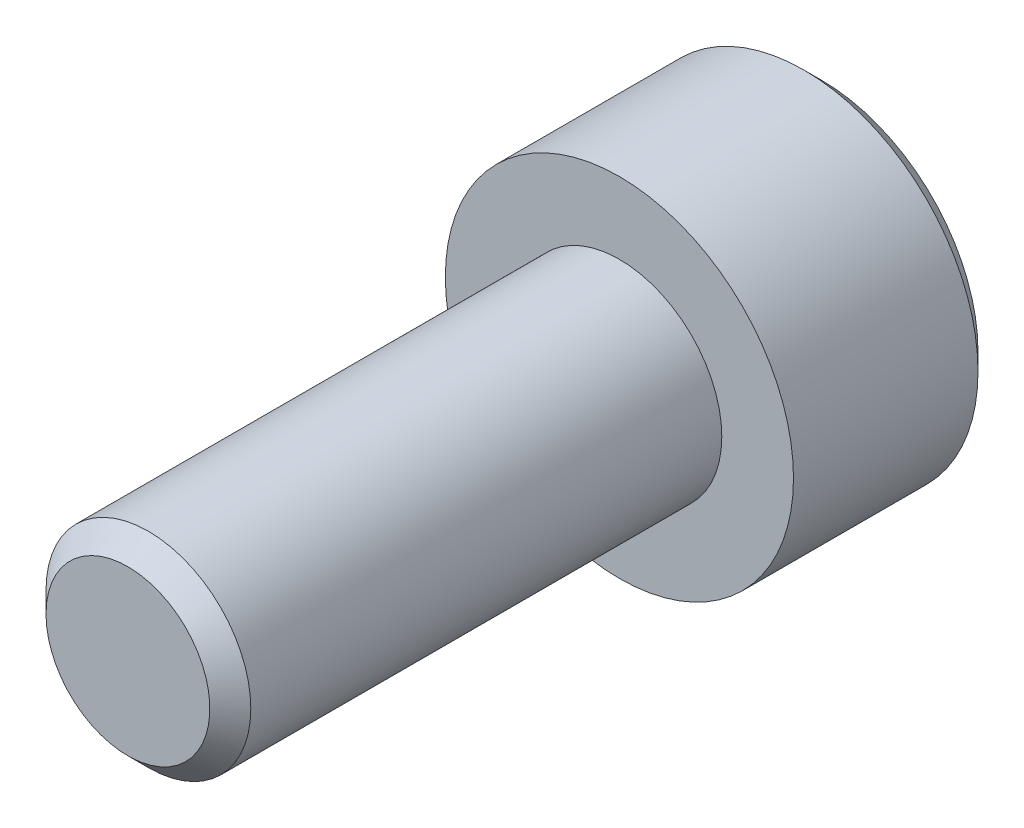
ISO-10303-21;
HEADER;
FILE_DESCRIPTION(('STEP AP214'),'2;1');
FILE_NAME('part.step','',(''),(''),'','','');
FILE_SCHEMA(('AUTOMOTIVE_DESIGN { 1 0 10303 214 1 1 1 1 }'));
ENDSEC;
DATA;
#1=APPLICATION_CONTEXT('core data for automotive mechanical design processes');
#2=APPLICATION_PROTOCOL_DEFINITION('international standard','automotive_design',2000,#1);
#3=PRODUCT_CONTEXT('',#1,'mechanical');
#4=PRODUCT('Part','Part','',(#3));
#5=PRODUCT_RELATED_PRODUCT_CATEGORY('part','',(#4));
#6=PRODUCT_DEFINITION_FORMATION('','',#4);
#7=PRODUCT_DEFINITION_CONTEXT('part definition',#1,'design');
#8=PRODUCT_DEFINITION('design','',#6,#7);
#9=PRODUCT_DEFINITION_SHAPE('','',#8);
#10=(LENGTH_UNIT() NAMED_UNIT(*) SI_UNIT(.MILLI.,.METRE.));
#11=(NAMED_UNIT(*) PLANE_ANGLE_UNIT() SI_UNIT($,.RADIAN.));
#12=(NAMED_UNIT(*) SI_UNIT($,.STERADIAN.) SOLID_ANGLE_UNIT());
#13=UNCERTAINTY_MEASURE_WITH_UNIT(LENGTH_MEASURE(1.E-05),#10,'distance_accuracy_value','');
#14=(GEOMETRIC_REPRESENTATION_CONTEXT(3) GLOBAL_UNCERTAINTY_ASSIGNED_CONTEXT((#13)) GLOBAL_UNIT_ASSIGNED_CONTEXT((#10,
#11,#12)) REPRESENTATION_CONTEXT('',''));
#15=CARTESIAN_POINT('',(0.,0.,0.));
#16=DIRECTION('',(0.,0.,1.));
#17=DIRECTION('',(1.,0.,0.));
#18=AXIS2_PLACEMENT_3D('',#15,#16,#17);
#19=CARTESIAN_POINT('',(0.,0.,-2.43));
#20=DIRECTION('',(0.,0.,1.));
#21=DIRECTION('',(1.,0.,0.));
#22=AXIS2_PLACEMENT_3D('',#19,#20,#21);
#23=PLANE('',#22);
#24=DIRECTION('',(-0.866025403784439,0.5,0.));
#25=VECTOR('',#24,1.);
#26=CARTESIAN_POINT('',(0.,2.3094010767585,-2.43));
#27=LINE('',#26,#25);
#28=CARTESIAN_POINT('',(0.,2.3094010767585,-2.43));
#29=VERTEX_POINT('',#28);
#30=CARTESIAN_POINT('',(2.,1.15470053837925,-2.43));
#31=VERTEX_POINT('',#30);
#32=EDGE_CURVE('E130',#29,#31,#27,.F.);
#33=ORIENTED_EDGE('',*,*,#32,.T.);
#34=DIRECTION('',(0.,1.,0.));
#35=VECTOR('',#34,1.);
#36=CARTESIAN_POINT('',(2.,1.15470053837925,-2.43));
#37=LINE('',#36,#35);
#38=CARTESIAN_POINT('',(2.,-1.15470053837925,-2.43));
#39=VERTEX_POINT('',#38);
#40=EDGE_CURVE('E125',#31,#39,#37,.F.);
#41=ORIENTED_EDGE('',*,*,#40,.T.);
#42=DIRECTION('',(0.866025403784439,0.499999999999999,0.));
#43=VECTOR('',#42,1.);
#44=CARTESIAN_POINT('',(2.,-1.15470053837925,-2.43));
#45=LINE('',#44,#43);
#46=CARTESIAN_POINT('',(0.,-2.3094010767585,-2.43));
#47=VERTEX_POINT('',#46);
#48=EDGE_CURVE('E74',#39,#47,#45,.F.);
#49=ORIENTED_EDGE('',*,*,#48,.T.);
#50=DIRECTION('',(0.866025403784438,-0.5,0.));
#51=VECTOR('',#50,1.);
#52=CARTESIAN_POINT('',(0.,-2.3094010767585,-2.43));
#53=LINE('',#52,#51);
#54=CARTESIAN_POINT('',(-2.,-1.15470053837925,-2.43));
#55=VERTEX_POINT('',#54);
#56=EDGE_CURVE('E71',#47,#55,#53,.F.);
#57=ORIENTED_EDGE('',*,*,#56,.T.);
#58=DIRECTION('',(0.,1.,0.));
#59=VECTOR('',#58,1.);
#60=CARTESIAN_POINT('',(-2.,-1.15470053837925,-2.43));
#61=LINE('',#60,#59);
#62=CARTESIAN_POINT('',(-2.,1.15470053837925,-2.43));
#63=VERTEX_POINT('',#62);
#64=EDGE_CURVE('E68',#55,#63,#61,.T.);
#65=ORIENTED_EDGE('',*,*,#64,.T.);
#66=DIRECTION('',(-0.866025403784439,-0.5,0.));
#67=VECTOR('',#66,1.);
#68=CARTESIAN_POINT('',(-2.,1.15470053837925,-2.43));
#69=LINE('',#68,#67);
#70=EDGE_CURVE('E91',#63,#29,#69,.F.);
#71=ORIENTED_EDGE('',*,*,#70,.T.);
#72=EDGE_LOOP('',(#33,#41,#49,#57,#65,#71));
#73=FACE_BOUND('',#72,.T.);
#74=ADVANCED_FACE('F17',(#73),#23,.F.);
#75=CARTESIAN_POINT('',(0.,-2.3094010767585,-4.93));
#76=DIRECTION('',(-0.5,-0.866025403784438,0.));
#77=DIRECTION('',(0.866025403784438,-0.5,0.));
#78=AXIS2_PLACEMENT_3D('',#75,#76,#77);
#79=PLANE('',#78);
#80=ORIENTED_EDGE('',*,*,#56,.F.);
#81=DIRECTION('',(0.,0.,1.));
#82=VECTOR('',#81,1.);
#83=CARTESIAN_POINT('',(0.,-2.3094010767585,-4.93));
#84=LINE('',#83,#82);
#85=CARTESIAN_POINT('',(0.,-2.3094010767585,-4.93));
#86=VERTEX_POINT('',#85);
#87=EDGE_CURVE('E120',#47,#86,#84,.F.);
#88=ORIENTED_EDGE('',*,*,#87,.T.);
#89=DIRECTION('',(-0.866025403784439,0.5,0.));
#90=VECTOR('',#89,1.);
#91=CARTESIAN_POINT('',(0.,-2.3094010767585,-4.93));
#92=LINE('',#91,#90);
#93=CARTESIAN_POINT('',(-2.,-1.15470053837925,-4.93));
#94=VERTEX_POINT('',#93);
#95=EDGE_CURVE('E82',#86,#94,#92,.T.);
#96=ORIENTED_EDGE('',*,*,#95,.T.);
#97=DIRECTION('',(0.,0.,1.));
#98=VECTOR('',#97,1.);
#99=CARTESIAN_POINT('',(-2.,-1.15470053837925,-4.93));
#100=LINE('',#99,#98);
#101=EDGE_CURVE('E77',#94,#55,#100,.T.);
#102=ORIENTED_EDGE('',*,*,#101,.T.);
#103=EDGE_LOOP('',(#80,#88,#96,#102));
#104=FACE_BOUND('',#103,.T.);
#105=ADVANCED_FACE('F80',(#104),#79,.F.);
#106=CARTESIAN_POINT('',(-2.,-1.15470053837925,-4.93));
#107=DIRECTION('',(-1.,0.,0.));
#108=DIRECTION('',(0.,0.,1.));
#109=AXIS2_PLACEMENT_3D('',#106,#107,#108);
#110=PLANE('',#109);
#111=ORIENTED_EDGE('',*,*,#64,.F.);
#112=ORIENTED_EDGE('',*,*,#101,.F.);
#113=DIRECTION('',(0.,1.,0.));
#114=VECTOR('',#113,1.);
#115=CARTESIAN_POINT('',(-2.,0.,-4.93));
#116=LINE('',#115,#114);
#117=CARTESIAN_POINT('',(-2.,1.15470053837925,-4.93));
#118=VERTEX_POINT('',#117);
#119=EDGE_CURVE('E117',#94,#118,#116,.T.);
#120=ORIENTED_EDGE('',*,*,#119,.T.);
#121=DIRECTION('',(0.,0.,1.));
#122=VECTOR('',#121,1.);
#123=CARTESIAN_POINT('',(-2.,1.15470053837925,-4.93));
#124=LINE('',#123,#122);
#125=EDGE_CURVE('E88',#118,#63,#124,.T.);
#126=ORIENTED_EDGE('',*,*,#125,.T.);
#127=EDGE_LOOP('',(#111,#112,#120,#126));
#128=FACE_BOUND('',#127,.T.);
#129=ADVANCED_FACE('F86',(#128),#110,.F.);
#130=CARTESIAN_POINT('',(-2.,1.15470053837925,-4.93));
#131=DIRECTION('',(-0.5,0.866025403784439,0.));
#132=DIRECTION('',(-0.866025403784439,-0.5,0.));
#133=AXIS2_PLACEMENT_3D('',#130,#131,#132);
#134=PLANE('',#133);
#135=ORIENTED_EDGE('',*,*,#70,.F.);
#136=ORIENTED_EDGE('',*,*,#125,.F.);
#137=DIRECTION('',(0.866025403784439,0.499999999999999,0.));
#138=VECTOR('',#137,1.);
#139=CARTESIAN_POINT('',(-2.,1.15470053837925,-4.93));
#140=LINE('',#139,#138);
#141=CARTESIAN_POINT('',(0.,2.3094010767585,-4.93));
#142=VERTEX_POINT('',#141);
#143=EDGE_CURVE('E115',#118,#142,#140,.T.);
#144=ORIENTED_EDGE('',*,*,#143,.T.);
#145=DIRECTION('',(0.,0.,1.));
#146=VECTOR('',#145,1.);
#147=CARTESIAN_POINT('',(0.,2.3094010767585,-4.93));
#148=LINE('',#147,#146);
#149=EDGE_CURVE('E132',#142,#29,#148,.T.);
#150=ORIENTED_EDGE('',*,*,#149,.T.);
#151=EDGE_LOOP('',(#135,#136,#144,#150));
#152=FACE_BOUND('',#151,.T.);
#153=ADVANCED_FACE('F137',(#152),#134,.F.);
#154=CARTESIAN_POINT('',(0.,2.3094010767585,-4.93));
#155=DIRECTION('',(0.5,0.866025403784439,0.));
#156=DIRECTION('',(-0.866025403784439,0.5,0.));
#157=AXIS2_PLACEMENT_3D('',#154,#155,#156);
#158=PLANE('',#157);
#159=ORIENTED_EDGE('',*,*,#32,.F.);
#160=ORIENTED_EDGE('',*,*,#149,.F.);
#161=DIRECTION('',(0.866025403784439,-0.5,0.));
#162=VECTOR('',#161,1.);
#163=CARTESIAN_POINT('',(0.,2.3094010767585,-4.93));
#164=LINE('',#163,#162);
#165=CARTESIAN_POINT('',(2.,1.15470053837925,-4.93));
#166=VERTEX_POINT('',#165);
#167=EDGE_CURVE('E113',#142,#166,#164,.T.);
#168=ORIENTED_EDGE('',*,*,#167,.T.);
#169=DIRECTION('',(0.,0.,-1.));
#170=VECTOR('',#169,1.);
#171=CARTESIAN_POINT('',(2.,1.15470053837925,-4.93));
#172=LINE('',#171,#170);
#173=EDGE_CURVE('E127',#166,#31,#172,.F.);
#174=ORIENTED_EDGE('',*,*,#173,.T.);
#175=EDGE_LOOP('',(#159,#160,#168,#174));
#176=FACE_BOUND('',#175,.T.);
#177=ADVANCED_FACE('F141',(#176),#158,.F.);
#178=CARTESIAN_POINT('',(2.,1.15470053837925,-4.93));
#179=DIRECTION('',(1.,0.,0.));
#180=DIRECTION('',(0.,0.,-1.));
#181=AXIS2_PLACEMENT_3D('',#178,#179,#180);
#182=PLANE('',#181);
#183=ORIENTED_EDGE('',*,*,#40,.F.);
#184=ORIENTED_EDGE('',*,*,#173,.F.);
#185=DIRECTION('',(0.,1.,0.));
#186=VECTOR('',#185,1.);
#187=CARTESIAN_POINT('',(2.,0.,-4.93));
#188=LINE('',#187,#186);
#189=CARTESIAN_POINT('',(2.,-1.15470053837925,-4.93));
#190=VERTEX_POINT('',#189);
#191=EDGE_CURVE('E35',#166,#190,#188,.F.);
#192=ORIENTED_EDGE('',*,*,#191,.T.);
#193=DIRECTION('',(0.,0.,1.));
#194=VECTOR('',#193,1.);
#195=CARTESIAN_POINT('',(2.,-1.15470053837925,-4.93));
#196=LINE('',#195,#194);
#197=EDGE_CURVE('E123',#190,#39,#196,.T.);
#198=ORIENTED_EDGE('',*,*,#197,.T.);
#199=EDGE_LOOP('',(#183,#184,#192,#198));
#200=FACE_BOUND('',#199,.T.);
#201=ADVANCED_FACE('F143',(#200),#182,.F.);
#202=CARTESIAN_POINT('',(2.,-1.15470053837925,-4.93));
#203=DIRECTION('',(0.499999999999999,-0.866025403784439,0.));
#204=DIRECTION('',(0.866025403784439,0.499999999999999,0.));
#205=AXIS2_PLACEMENT_3D('',#202,#203,#204);
#206=PLANE('',#205);
#207=ORIENTED_EDGE('',*,*,#48,.F.);
#208=ORIENTED_EDGE('',*,*,#197,.F.);
#209=DIRECTION('',(-0.866025403784439,-0.499999999999999,0.));
#210=VECTOR('',#209,1.);
#211=CARTESIAN_POINT('',(2.,-1.15470053837925,-4.93));
#212=LINE('',#211,#210);
#213=EDGE_CURVE('E107',#190,#86,#212,.T.);
#214=ORIENTED_EDGE('',*,*,#213,.T.);
#215=ORIENTED_EDGE('',*,*,#87,.F.);
#216=EDGE_LOOP('',(#207,#208,#214,#215));
#217=FACE_BOUND('',#216,.T.);
#218=ADVANCED_FACE('F146',(#217),#206,.F.);
#219=CARTESIAN_POINT('',(0.,0.,-4.93));
#220=DIRECTION('',(0.,0.,1.));
#221=DIRECTION('',(1.,0.,0.));
#222=AXIS2_PLACEMENT_3D('',#219,#220,#221);
#223=PLANE('',#222);
#224=ORIENTED_EDGE('',*,*,#191,.F.);
#225=ORIENTED_EDGE('',*,*,#167,.F.);
#226=ORIENTED_EDGE('',*,*,#143,.F.);
#227=ORIENTED_EDGE('',*,*,#119,.F.);
#228=ORIENTED_EDGE('',*,*,#95,.F.);
#229=ORIENTED_EDGE('',*,*,#213,.F.);
#230=EDGE_LOOP('',(#224,#225,#226,#227,#228,#229));
#231=FACE_BOUND('',#230,.T.);
#232=CARTESIAN_POINT('',(0.,0.,-4.9300000000585));
#233=DIRECTION('',(0.,0.,1.));
#234=DIRECTION('',(1.,0.,0.));
#235=AXIS2_PLACEMENT_3D('',#232,#233,#234);
#236=CIRCLE('',#235,3.82500000000618);
#237=CARTESIAN_POINT('',(3.82500000000618,0.,-4.9300000000585));
#238=VERTEX_POINT('',#237);
#239=EDGE_CURVE('E20',#238,#238,#236,.T.);
#240=ORIENTED_EDGE('',*,*,#239,.F.);
#241=EDGE_LOOP('',(#240));
#242=FACE_BOUND('',#241,.T.);
#243=ADVANCED_FACE('F148',(#231,#242),#223,.F.);
#244=CARTESIAN_POINT('',(0.,0.,-4.50499999999465));
#245=DIRECTION('',(0.,0.,1.));
#246=DIRECTION('',(1.,0.,0.));
#247=AXIS2_PLACEMENT_3D('',#244,#245,#246);
#248=CONICAL_SURFACE('',#247,4.25000000007003,0.785398163397448);
#249=ORIENTED_EDGE('',*,*,#239,.T.);
#250=EDGE_LOOP('',(#249));
#251=FACE_BOUND('',#250,.T.);
#252=CARTESIAN_POINT('',(0.,0.,-4.505));
#253=DIRECTION('',(0.,0.,1.));
#254=DIRECTION('',(1.,0.,0.));
#255=AXIS2_PLACEMENT_3D('',#252,#253,#254);
#256=CIRCLE('',#255,4.25);
#257=CARTESIAN_POINT('',(4.25,0.,-4.505));
#258=VERTEX_POINT('',#257);
#259=EDGE_CURVE('E99',#258,#258,#256,.T.);
#260=ORIENTED_EDGE('',*,*,#259,.F.);
#261=EDGE_LOOP('',(#260));
#262=FACE_BOUND('',#261,.T.);
#263=ADVANCED_FACE('F151',(#251,#262),#248,.T.);
#264=CARTESIAN_POINT('',(0.,0.,12.));
#265=DIRECTION('',(0.,0.,1.));
#266=DIRECTION('',(1.,0.,0.));
#267=AXIS2_PLACEMENT_3D('',#264,#265,#266);
#268=PLANE('',#267);
#269=CARTESIAN_POINT('',(0.,0.,12.0000000000005));
#270=DIRECTION('',(0.,0.,-1.));
#271=DIRECTION('',(-1.,0.,0.));
#272=AXIS2_PLACEMENT_3D('',#269,#270,#271);
#273=CIRCLE('',#272,1.99999999995271);
#274=CARTESIAN_POINT('',(-1.99999999995271,0.,12.0000000000005));
#275=VERTEX_POINT('',#274);
#276=EDGE_CURVE('E97',#275,#275,#273,.T.);
#277=ORIENTED_EDGE('',*,*,#276,.F.);
#278=EDGE_LOOP('',(#277));
#279=FACE_BOUND('',#278,.T.);
#280=ADVANCED_FACE('F157',(#279),#268,.T.);
#281=CARTESIAN_POINT('',(0.,0.,-4.93));
#282=DIRECTION('',(0.,0.,1.));
#283=DIRECTION('',(1.,0.,0.));
#284=AXIS2_PLACEMENT_3D('',#281,#282,#283);
#285=CYLINDRICAL_SURFACE('',#284,4.25);
#286=ORIENTED_EDGE('',*,*,#259,.T.);
#287=EDGE_LOOP('',(#286));
#288=FACE_BOUND('',#287,.T.);
#289=CARTESIAN_POINT('',(0.,0.,0.));
#290=DIRECTION('',(0.,0.,1.));
#291=DIRECTION('',(1.,0.,0.));
#292=AXIS2_PLACEMENT_3D('',#289,#290,#291);
#293=CIRCLE('',#292,4.25);
#294=CARTESIAN_POINT('',(4.25,0.,0.));
#295=VERTEX_POINT('',#294);
#296=EDGE_CURVE('E95',#295,#295,#293,.T.);
#297=ORIENTED_EDGE('',*,*,#296,.F.);
#298=EDGE_LOOP('',(#297));
#299=FACE_BOUND('',#298,.T.);
#300=ADVANCED_FACE('F163',(#288,#299),#285,.T.);
#301=CARTESIAN_POINT('',(0.,0.,11.4999999998986));
#302=DIRECTION('',(0.,0.,-1.));
#303=DIRECTION('',(-1.,0.,0.));
#304=AXIS2_PLACEMENT_3D('',#301,#302,#303);
#305=CONICAL_SURFACE('',#304,2.50000000005457,0.785398163397448);
#306=CARTESIAN_POINT('',(0.,0.,11.5));
#307=DIRECTION('',(0.,0.,1.));
#308=DIRECTION('',(1.,0.,0.));
#309=AXIS2_PLACEMENT_3D('',#306,#307,#308);
#310=CIRCLE('',#309,2.5);
#311=CARTESIAN_POINT('',(2.5,0.,11.5));
#312=VERTEX_POINT('',#311);
#313=EDGE_CURVE('E26',#312,#312,#310,.F.);
#314=ORIENTED_EDGE('',*,*,#313,.F.);
#315=EDGE_LOOP('',(#314));
#316=FACE_BOUND('',#315,.T.);
#317=ORIENTED_EDGE('',*,*,#276,.T.);
#318=EDGE_LOOP('',(#317));
#319=FACE_BOUND('',#318,.T.);
#320=ADVANCED_FACE('F174',(#316,#319),#305,.T.);
#321=CARTESIAN_POINT('',(0.,0.,0.));
#322=DIRECTION('',(0.,0.,1.));
#323=DIRECTION('',(1.,0.,0.));
#324=AXIS2_PLACEMENT_3D('',#321,#322,#323);
#325=PLANE('',#324);
#326=CARTESIAN_POINT('',(0.,0.,0.));
#327=DIRECTION('',(0.,0.,1.));
#328=DIRECTION('',(1.,0.,0.));
#329=AXIS2_PLACEMENT_3D('',#326,#327,#328);
#330=CIRCLE('',#329,2.5);
#331=CARTESIAN_POINT('',(2.5,0.,0.));
#332=VERTEX_POINT('',#331);
#333=EDGE_CURVE('E11',#332,#332,#330,.T.);
#334=ORIENTED_EDGE('',*,*,#333,.F.);
#335=EDGE_LOOP('',(#334));
#336=FACE_BOUND('',#335,.T.);
#337=ORIENTED_EDGE('',*,*,#296,.T.);
#338=EDGE_LOOP('',(#337));
#339=FACE_BOUND('',#338,.T.);
#340=ADVANCED_FACE('F168',(#336,#339),#325,.T.);
#341=CARTESIAN_POINT('',(0.,0.,0.));
#342=DIRECTION('',(0.,0.,1.));
#343=DIRECTION('',(1.,0.,0.));
#344=AXIS2_PLACEMENT_3D('',#341,#342,#343);
#345=CYLINDRICAL_SURFACE('',#344,2.5);
#346=ORIENTED_EDGE('',*,*,#333,.T.);
#347=EDGE_LOOP('',(#346));
#348=FACE_BOUND('',#347,.T.);
#349=ORIENTED_EDGE('',*,*,#313,.T.);
#350=EDGE_LOOP('',(#349));
#351=FACE_BOUND('',#350,.T.);
#352=ADVANCED_FACE('F166',(#348,#351),#345,.T.);
#353=CLOSED_SHELL('',(#74,#105,#129,#153,#177,#201,#218,#243,#263,#280,#300,#320,#340,#352));
#354=MANIFOLD_SOLID_BREP('B1',#353);
#355=ADVANCED_BREP_SHAPE_REPRESENTATION('',(#18,#354),#14);
#356=SHAPE_DEFINITION_REPRESENTATION(#9,#355);
ENDSEC;
END-ISO-10303-21;
